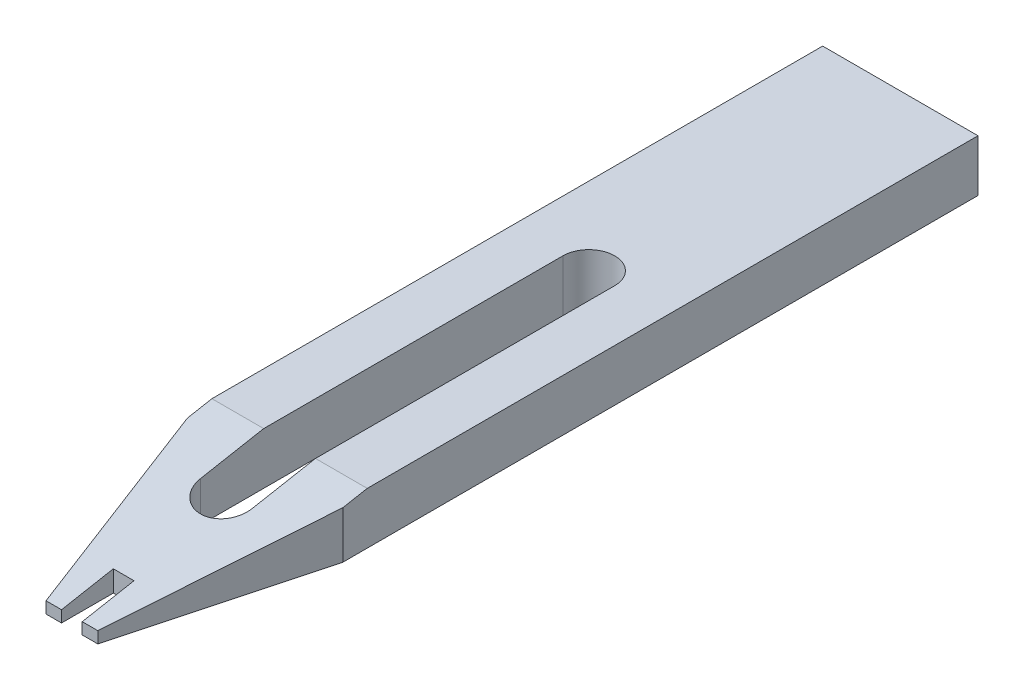
ISO-10303-21;
HEADER;
FILE_DESCRIPTION(('STEP AP214'),'2;1');
FILE_NAME('part.step','',(''),(''),'','','');
FILE_SCHEMA(('AUTOMOTIVE_DESIGN { 1 0 10303 214 1 1 1 1 }'));
ENDSEC;
DATA;
#1=APPLICATION_CONTEXT('core data for automotive mechanical design processes');
#2=APPLICATION_PROTOCOL_DEFINITION('international standard','automotive_design',2000,#1);
#3=PRODUCT_CONTEXT('',#1,'mechanical');
#4=PRODUCT('Part','Part','',(#3));
#5=PRODUCT_RELATED_PRODUCT_CATEGORY('part','',(#4));
#6=PRODUCT_DEFINITION_FORMATION('','',#4);
#7=PRODUCT_DEFINITION_CONTEXT('part definition',#1,'design');
#8=PRODUCT_DEFINITION('design','',#6,#7);
#9=PRODUCT_DEFINITION_SHAPE('','',#8);
#10=(LENGTH_UNIT() NAMED_UNIT(*) SI_UNIT(.MILLI.,.METRE.));
#11=(NAMED_UNIT(*) PLANE_ANGLE_UNIT() SI_UNIT($,.RADIAN.));
#12=(NAMED_UNIT(*) SI_UNIT($,.STERADIAN.) SOLID_ANGLE_UNIT());
#13=UNCERTAINTY_MEASURE_WITH_UNIT(LENGTH_MEASURE(1.E-05),#10,'distance_accuracy_value','');
#14=(GEOMETRIC_REPRESENTATION_CONTEXT(3) GLOBAL_UNCERTAINTY_ASSIGNED_CONTEXT((#13)) GLOBAL_UNIT_ASSIGNED_CONTEXT((#10,
#11,#12)) REPRESENTATION_CONTEXT('',''));
#15=CARTESIAN_POINT('',(0.,0.,0.));
#16=DIRECTION('',(0.,0.,1.));
#17=DIRECTION('',(1.,0.,0.));
#18=AXIS2_PLACEMENT_3D('',#15,#16,#17);
#19=CARTESIAN_POINT('',(7.50000000000001,5.,40.));
#20=DIRECTION('',(0.,-1.,0.));
#21=DIRECTION('',(0.,0.,-1.));
#22=AXIS2_PLACEMENT_3D('',#19,#20,#21);
#23=PLANE('',#22);
#24=DIRECTION('',(-1.,0.,0.));
#25=VECTOR('',#24,1.);
#26=CARTESIAN_POINT('',(7.50000000000001,5.,18.9793189364087));
#27=LINE('',#26,#25);
#28=CARTESIAN_POINT('',(7.5,5.,18.9793189364087));
#29=VERTEX_POINT('',#28);
#30=CARTESIAN_POINT('',(2.5,5.,18.9793189364087));
#31=VERTEX_POINT('',#30);
#32=EDGE_CURVE('E257',#29,#31,#27,.T.);
#33=ORIENTED_EDGE('',*,*,#32,.F.);
#34=DIRECTION('',(0.,0.,-1.));
#35=VECTOR('',#34,1.);
#36=CARTESIAN_POINT('',(7.5,5.,-40.));
#37=LINE('',#36,#35);
#38=CARTESIAN_POINT('',(7.5,5.,-40.));
#39=VERTEX_POINT('',#38);
#40=EDGE_CURVE('E150',#29,#39,#37,.T.);
#41=ORIENTED_EDGE('',*,*,#40,.T.);
#42=DIRECTION('',(-1.,0.,0.));
#43=VECTOR('',#42,1.);
#44=CARTESIAN_POINT('',(-7.5,5.,-40.));
#45=LINE('',#44,#43);
#46=CARTESIAN_POINT('',(-7.5,5.,-40.));
#47=VERTEX_POINT('',#46);
#48=EDGE_CURVE('E204',#39,#47,#45,.T.);
#49=ORIENTED_EDGE('',*,*,#48,.T.);
#50=DIRECTION('',(0.,0.,1.));
#51=VECTOR('',#50,1.);
#52=CARTESIAN_POINT('',(-7.5,5.,-40.));
#53=LINE('',#52,#51);
#54=CARTESIAN_POINT('',(-7.5,5.,18.9793189364087));
#55=VERTEX_POINT('',#54);
#56=EDGE_CURVE('E178',#47,#55,#53,.T.);
#57=ORIENTED_EDGE('',*,*,#56,.T.);
#58=CARTESIAN_POINT('',(-2.5,5.,18.9793189364087));
#59=VERTEX_POINT('',#58);
#60=EDGE_CURVE('E228',#59,#55,#27,.T.);
#61=ORIENTED_EDGE('',*,*,#60,.F.);
#62=DIRECTION('',(0.,0.,1.));
#63=VECTOR('',#62,1.);
#64=CARTESIAN_POINT('',(-2.5,5.,25.0787734286576));
#65=LINE('',#64,#63);
#66=CARTESIAN_POINT('',(-2.5,5.,-9.92122657134237));
#67=VERTEX_POINT('',#66);
#68=EDGE_CURVE('E214',#67,#59,#65,.T.);
#69=ORIENTED_EDGE('',*,*,#68,.F.);
#70=CARTESIAN_POINT('',(0.,5.,-9.92122657134237));
#71=DIRECTION('',(0.,1.,0.));
#72=DIRECTION('',(0.,0.,1.));
#73=AXIS2_PLACEMENT_3D('',#70,#71,#72);
#74=CIRCLE('',#73,2.5);
#75=CARTESIAN_POINT('',(2.5,5.,-9.92122657134237));
#76=VERTEX_POINT('',#75);
#77=EDGE_CURVE('E231',#76,#67,#74,.T.);
#78=ORIENTED_EDGE('',*,*,#77,.F.);
#79=DIRECTION('',(0.,0.,-1.));
#80=VECTOR('',#79,1.);
#81=CARTESIAN_POINT('',(2.5,5.,25.0787734286576));
#82=LINE('',#81,#80);
#83=EDGE_CURVE('E218',#31,#76,#82,.T.);
#84=ORIENTED_EDGE('',*,*,#83,.F.);
#85=EDGE_LOOP('',(#33,#41,#49,#57,#61,#69,#78,#84));
#86=FACE_BOUND('',#85,.T.);
#87=ADVANCED_FACE('F31',(#86),#23,.F.);
#88=CARTESIAN_POINT('',(1.00000000000001,5.,40.));
#89=DIRECTION('',(0.,0.,-1.));
#90=DIRECTION('',(-1.,0.,0.));
#91=AXIS2_PLACEMENT_3D('',#88,#89,#90);
#92=PLANE('',#91);
#93=DIRECTION('',(1.,0.,0.));
#94=VECTOR('',#93,1.);
#95=CARTESIAN_POINT('',(1.00000000000001,1.11230414737882,40.));
#96=LINE('',#95,#94);
#97=CARTESIAN_POINT('',(1.00000000000001,1.11230414737882,40.));
#98=VERTEX_POINT('',#97);
#99=CARTESIAN_POINT('',(2.5,1.11230414737882,40.));
#100=VERTEX_POINT('',#99);
#101=EDGE_CURVE('E46',#98,#100,#96,.T.);
#102=ORIENTED_EDGE('',*,*,#101,.F.);
#103=DIRECTION('',(0.,-1.,0.));
#104=VECTOR('',#103,1.);
#105=CARTESIAN_POINT('',(1.00000000000001,5.,40.));
#106=LINE('',#105,#104);
#107=CARTESIAN_POINT('',(1.00000000000001,0.,40.));
#108=VERTEX_POINT('',#107);
#109=EDGE_CURVE('E176',#98,#108,#106,.T.);
#110=ORIENTED_EDGE('',*,*,#109,.T.);
#111=DIRECTION('',(1.,0.,0.));
#112=VECTOR('',#111,1.);
#113=CARTESIAN_POINT('',(1.00000000000001,0.,40.));
#114=LINE('',#113,#112);
#115=CARTESIAN_POINT('',(2.5,0.,40.));
#116=VERTEX_POINT('',#115);
#117=EDGE_CURVE('E198',#108,#116,#114,.T.);
#118=ORIENTED_EDGE('',*,*,#117,.T.);
#119=DIRECTION('',(0.,1.,0.));
#120=VECTOR('',#119,1.);
#121=CARTESIAN_POINT('',(2.5,5.,40.));
#122=LINE('',#121,#120);
#123=EDGE_CURVE('E39',#116,#100,#122,.T.);
#124=ORIENTED_EDGE('',*,*,#123,.T.);
#125=EDGE_LOOP('',(#102,#110,#118,#124));
#126=FACE_BOUND('',#125,.T.);
#127=ADVANCED_FACE('F302',(#126),#92,.F.);
#128=CARTESIAN_POINT('',(7.5,5.,-40.));
#129=DIRECTION('',(-1.,0.,0.));
#130=DIRECTION('',(0.,0.,1.));
#131=AXIS2_PLACEMENT_3D('',#128,#129,#130);
#132=PLANE('',#131);
#133=DIRECTION('',(0.,0.18186208197361,-0.983324047880567));
#134=VECTOR('',#133,1.);
#135=CARTESIAN_POINT('',(7.5,15.5472337761972,-38.0493288069829));
#136=LINE('',#135,#134);
#137=CARTESIAN_POINT('',(7.50000000000011,4.56344790491569,21.3397459621553));
#138=VERTEX_POINT('',#137);
#139=EDGE_CURVE('E142',#138,#29,#136,.T.);
#140=ORIENTED_EDGE('',*,*,#139,.F.);
#141=DIRECTION('',(0.,-1.,0.));
#142=VECTOR('',#141,1.);
#143=CARTESIAN_POINT('',(7.5,5.,21.3397459621557));
#144=LINE('',#143,#142);
#145=CARTESIAN_POINT('',(7.50000000000005,0.,21.3397459621553));
#146=VERTEX_POINT('',#145);
#147=EDGE_CURVE('E53',#138,#146,#144,.T.);
#148=ORIENTED_EDGE('',*,*,#147,.T.);
#149=DIRECTION('',(0.,0.,-1.));
#150=VECTOR('',#149,1.);
#151=CARTESIAN_POINT('',(7.5,0.,-40.));
#152=LINE('',#151,#150);
#153=CARTESIAN_POINT('',(7.5,0.,-40.));
#154=VERTEX_POINT('',#153);
#155=EDGE_CURVE('E196',#146,#154,#152,.T.);
#156=ORIENTED_EDGE('',*,*,#155,.T.);
#157=DIRECTION('',(0.,-1.,0.));
#158=VECTOR('',#157,1.);
#159=CARTESIAN_POINT('',(7.5,5.,-40.));
#160=LINE('',#159,#158);
#161=EDGE_CURVE('E164',#39,#154,#160,.T.);
#162=ORIENTED_EDGE('',*,*,#161,.F.);
#163=ORIENTED_EDGE('',*,*,#40,.F.);
#164=EDGE_LOOP('',(#140,#148,#156,#162,#163));
#165=FACE_BOUND('',#164,.T.);
#166=ADVANCED_FACE('F148',(#165),#132,.F.);
#167=CARTESIAN_POINT('',(-7.5,5.,-40.));
#168=DIRECTION('',(1.,0.,0.));
#169=DIRECTION('',(0.,0.,-1.));
#170=AXIS2_PLACEMENT_3D('',#167,#168,#169);
#171=PLANE('',#170);
#172=DIRECTION('',(0.,-0.18186208197361,0.983324047880567));
#173=VECTOR('',#172,1.);
#174=CARTESIAN_POINT('',(-7.5,15.5472337761972,-38.0493288069829));
#175=LINE('',#174,#173);
#176=CARTESIAN_POINT('',(-7.50000000000014,4.56344790491572,21.3397459621551));
#177=VERTEX_POINT('',#176);
#178=EDGE_CURVE('E235',#55,#177,#175,.T.);
#179=ORIENTED_EDGE('',*,*,#178,.F.);
#180=ORIENTED_EDGE('',*,*,#56,.F.);
#181=DIRECTION('',(0.,-1.,0.));
#182=VECTOR('',#181,1.);
#183=CARTESIAN_POINT('',(-7.5,5.,-40.));
#184=LINE('',#183,#182);
#185=CARTESIAN_POINT('',(-7.5,0.,-40.));
#186=VERTEX_POINT('',#185);
#187=EDGE_CURVE('E167',#47,#186,#184,.T.);
#188=ORIENTED_EDGE('',*,*,#187,.T.);
#189=DIRECTION('',(0.,0.,1.));
#190=VECTOR('',#189,1.);
#191=CARTESIAN_POINT('',(-7.5,0.,-40.));
#192=LINE('',#191,#190);
#193=CARTESIAN_POINT('',(-7.5,0.,21.3397459621557));
#194=VERTEX_POINT('',#193);
#195=EDGE_CURVE('E191',#186,#194,#192,.T.);
#196=ORIENTED_EDGE('',*,*,#195,.T.);
#197=DIRECTION('',(0.,1.,0.));
#198=VECTOR('',#197,1.);
#199=CARTESIAN_POINT('',(-7.5,5.,21.3397459621557));
#200=LINE('',#199,#198);
#201=EDGE_CURVE('E154',#194,#177,#200,.T.);
#202=ORIENTED_EDGE('',*,*,#201,.T.);
#203=EDGE_LOOP('',(#179,#180,#188,#196,#202));
#204=FACE_BOUND('',#203,.T.);
#205=ADVANCED_FACE('F265',(#204),#171,.F.);
#206=CARTESIAN_POINT('',(-0.999999999999995,5.,40.));
#207=DIRECTION('',(0.,0.,-1.));
#208=DIRECTION('',(-1.,0.,0.));
#209=AXIS2_PLACEMENT_3D('',#206,#207,#208);
#210=PLANE('',#209);
#211=DIRECTION('',(1.,0.,0.));
#212=VECTOR('',#211,1.);
#213=CARTESIAN_POINT('',(-0.999999999999995,1.11230414737882,40.));
#214=LINE('',#213,#212);
#215=CARTESIAN_POINT('',(-2.49999999999999,1.11230414737882,40.));
#216=VERTEX_POINT('',#215);
#217=CARTESIAN_POINT('',(-0.999999999999995,1.11230414737882,40.));
#218=VERTEX_POINT('',#217);
#219=EDGE_CURVE('E243',#216,#218,#214,.T.);
#220=ORIENTED_EDGE('',*,*,#219,.F.);
#221=DIRECTION('',(0.,-1.,0.));
#222=VECTOR('',#221,1.);
#223=CARTESIAN_POINT('',(-2.49999999999998,5.,40.));
#224=LINE('',#223,#222);
#225=CARTESIAN_POINT('',(-2.49999999999999,0.,40.));
#226=VERTEX_POINT('',#225);
#227=EDGE_CURVE('E162',#216,#226,#224,.T.);
#228=ORIENTED_EDGE('',*,*,#227,.T.);
#229=DIRECTION('',(1.,0.,0.));
#230=VECTOR('',#229,1.);
#231=CARTESIAN_POINT('',(-0.999999999999995,0.,40.));
#232=LINE('',#231,#230);
#233=CARTESIAN_POINT('',(-0.999999999999995,0.,40.));
#234=VERTEX_POINT('',#233);
#235=EDGE_CURVE('E188',#226,#234,#232,.T.);
#236=ORIENTED_EDGE('',*,*,#235,.T.);
#237=DIRECTION('',(0.,-1.,0.));
#238=VECTOR('',#237,1.);
#239=CARTESIAN_POINT('',(-0.999999999999995,5.,40.));
#240=LINE('',#239,#238);
#241=EDGE_CURVE('E170',#218,#234,#240,.T.);
#242=ORIENTED_EDGE('',*,*,#241,.F.);
#243=EDGE_LOOP('',(#220,#228,#236,#242));
#244=FACE_BOUND('',#243,.T.);
#245=ADVANCED_FACE('F286',(#244),#210,.F.);
#246=CARTESIAN_POINT('',(-0.999999999999995,5.,40.));
#247=DIRECTION('',(-1.,0.,0.));
#248=DIRECTION('',(0.,0.,1.));
#249=AXIS2_PLACEMENT_3D('',#246,#247,#248);
#250=PLANE('',#249);
#251=DIRECTION('',(0.,0.18186208197361,-0.983324047880567));
#252=VECTOR('',#251,1.);
#253=CARTESIAN_POINT('',(-0.999999999999995,1.24088508801492,39.304765844235));
#254=LINE('',#253,#252);
#255=CARTESIAN_POINT('',(-0.999999999999996,2.03703533017452,35.));
#256=VERTEX_POINT('',#255);
#257=EDGE_CURVE('E245',#218,#256,#254,.T.);
#258=ORIENTED_EDGE('',*,*,#257,.F.);
#259=ORIENTED_EDGE('',*,*,#241,.T.);
#260=DIRECTION('',(0.,0.,-1.));
#261=VECTOR('',#260,1.);
#262=CARTESIAN_POINT('',(-0.999999999999995,0.,40.));
#263=LINE('',#262,#261);
#264=CARTESIAN_POINT('',(-0.999999999999996,0.,35.));
#265=VERTEX_POINT('',#264);
#266=EDGE_CURVE('E185',#234,#265,#263,.T.);
#267=ORIENTED_EDGE('',*,*,#266,.T.);
#268=DIRECTION('',(0.,-1.,0.));
#269=VECTOR('',#268,1.);
#270=CARTESIAN_POINT('',(-0.999999999999996,5.,35.));
#271=LINE('',#270,#269);
#272=EDGE_CURVE('E172',#256,#265,#271,.T.);
#273=ORIENTED_EDGE('',*,*,#272,.F.);
#274=EDGE_LOOP('',(#258,#259,#267,#273));
#275=FACE_BOUND('',#274,.T.);
#276=ADVANCED_FACE('F288',(#275),#250,.F.);
#277=CARTESIAN_POINT('',(-0.999999999999996,5.,35.));
#278=DIRECTION('',(0.,0.,-1.));
#279=DIRECTION('',(-1.,0.,0.));
#280=AXIS2_PLACEMENT_3D('',#277,#278,#279);
#281=PLANE('',#280);
#282=DIRECTION('',(1.,0.,0.));
#283=VECTOR('',#282,1.);
#284=CARTESIAN_POINT('',(-0.999999999999996,2.03703533017452,35.));
#285=LINE('',#284,#283);
#286=CARTESIAN_POINT('',(1.,2.03703533017452,35.));
#287=VERTEX_POINT('',#286);
#288=EDGE_CURVE('E247',#256,#287,#285,.T.);
#289=ORIENTED_EDGE('',*,*,#288,.F.);
#290=ORIENTED_EDGE('',*,*,#272,.T.);
#291=DIRECTION('',(1.,0.,0.));
#292=VECTOR('',#291,1.);
#293=CARTESIAN_POINT('',(-0.999999999999996,0.,35.));
#294=LINE('',#293,#292);
#295=CARTESIAN_POINT('',(1.,0.,35.));
#296=VERTEX_POINT('',#295);
#297=EDGE_CURVE('E182',#265,#296,#294,.T.);
#298=ORIENTED_EDGE('',*,*,#297,.T.);
#299=DIRECTION('',(0.,-1.,0.));
#300=VECTOR('',#299,1.);
#301=CARTESIAN_POINT('',(1.,5.,35.));
#302=LINE('',#301,#300);
#303=EDGE_CURVE('E174',#287,#296,#302,.T.);
#304=ORIENTED_EDGE('',*,*,#303,.F.);
#305=EDGE_LOOP('',(#289,#290,#298,#304));
#306=FACE_BOUND('',#305,.T.);
#307=ADVANCED_FACE('F295',(#306),#281,.F.);
#308=CARTESIAN_POINT('',(1.,5.,35.));
#309=DIRECTION('',(1.,0.,0.));
#310=DIRECTION('',(0.,0.,-1.));
#311=AXIS2_PLACEMENT_3D('',#308,#309,#310);
#312=PLANE('',#311);
#313=DIRECTION('',(0.,-0.18186208197361,0.983324047880567));
#314=VECTOR('',#313,1.);
#315=CARTESIAN_POINT('',(1.,2.13503188102631,34.4701349285339));
#316=LINE('',#315,#314);
#317=EDGE_CURVE('E249',#287,#98,#316,.T.);
#318=ORIENTED_EDGE('',*,*,#317,.F.);
#319=ORIENTED_EDGE('',*,*,#303,.T.);
#320=DIRECTION('',(0.,0.,1.));
#321=VECTOR('',#320,1.);
#322=CARTESIAN_POINT('',(1.,0.,35.));
#323=LINE('',#322,#321);
#324=EDGE_CURVE('E179',#296,#108,#323,.T.);
#325=ORIENTED_EDGE('',*,*,#324,.T.);
#326=ORIENTED_EDGE('',*,*,#109,.F.);
#327=EDGE_LOOP('',(#318,#319,#325,#326));
#328=FACE_BOUND('',#327,.T.);
#329=ADVANCED_FACE('F298',(#328),#312,.F.);
#330=CARTESIAN_POINT('',(0.,5.,25.0787734286576));
#331=DIRECTION('',(0.,-1.,0.));
#332=DIRECTION('',(0.,0.,-1.));
#333=AXIS2_PLACEMENT_3D('',#330,#331,#332);
#334=CYLINDRICAL_SURFACE('',#333,2.5);
#335=DIRECTION('',(0.,-1.,0.));
#336=VECTOR('',#335,1.);
#337=CARTESIAN_POINT('',(-2.5,5.,25.0787734286576));
#338=LINE('',#337,#336);
#339=CARTESIAN_POINT('',(-2.5,3.87192884659483,25.0787734286576));
#340=VERTEX_POINT('',#339);
#341=CARTESIAN_POINT('',(-2.5,0.,25.0787734286576));
#342=VERTEX_POINT('',#341);
#343=EDGE_CURVE('E212',#340,#342,#338,.T.);
#344=ORIENTED_EDGE('',*,*,#343,.F.);
#345=CARTESIAN_POINT('',(0.,3.87192884659483,25.0787734286576));
#346=DIRECTION('',(0.,0.983324047880567,0.18186208197361));
#347=DIRECTION('',(0.,-0.18186208197361,0.983324047880567));
#348=AXIS2_PLACEMENT_3D('',#345,#346,#347);
#349=ELLIPSE('',#348,2.54239688878599,2.5);
#350=CARTESIAN_POINT('',(2.5,3.87192884659483,25.0787734286576));
#351=VERTEX_POINT('',#350);
#352=EDGE_CURVE('E251',#340,#351,#349,.T.);
#353=ORIENTED_EDGE('',*,*,#352,.T.);
#354=DIRECTION('',(0.,-1.,0.));
#355=VECTOR('',#354,1.);
#356=CARTESIAN_POINT('',(2.5,5.,25.0787734286576));
#357=LINE('',#356,#355);
#358=CARTESIAN_POINT('',(2.5,0.,25.0787734286576));
#359=VERTEX_POINT('',#358);
#360=EDGE_CURVE('E201',#351,#359,#357,.T.);
#361=ORIENTED_EDGE('',*,*,#360,.T.);
#362=CARTESIAN_POINT('',(0.,0.,25.0787734286576));
#363=DIRECTION('',(0.,1.,0.));
#364=DIRECTION('',(0.,0.,1.));
#365=AXIS2_PLACEMENT_3D('',#362,#363,#364);
#366=CIRCLE('',#365,2.5);
#367=EDGE_CURVE('E225',#342,#359,#366,.T.);
#368=ORIENTED_EDGE('',*,*,#367,.F.);
#369=EDGE_LOOP('',(#344,#353,#361,#368));
#370=FACE_BOUND('',#369,.T.);
#371=ADVANCED_FACE('F324',(#370),#334,.F.);
#372=CARTESIAN_POINT('',(2.5,5.,25.0787734286576));
#373=DIRECTION('',(-1.,0.,0.));
#374=DIRECTION('',(0.,0.,1.));
#375=AXIS2_PLACEMENT_3D('',#372,#373,#374);
#376=PLANE('',#375);
#377=ORIENTED_EDGE('',*,*,#360,.F.);
#378=DIRECTION('',(0.,0.18186208197361,-0.983324047880567));
#379=VECTOR('',#378,1.);
#380=CARTESIAN_POINT('',(2.5,3.90923846532735,24.8770411878365));
#381=LINE('',#380,#379);
#382=EDGE_CURVE('E254',#351,#31,#381,.T.);
#383=ORIENTED_EDGE('',*,*,#382,.T.);
#384=ORIENTED_EDGE('',*,*,#83,.T.);
#385=DIRECTION('',(0.,-1.,0.));
#386=VECTOR('',#385,1.);
#387=CARTESIAN_POINT('',(2.5,5.,-9.92122657134237));
#388=LINE('',#387,#386);
#389=CARTESIAN_POINT('',(2.5,0.,-9.92122657134237));
#390=VERTEX_POINT('',#389);
#391=EDGE_CURVE('E208',#76,#390,#388,.T.);
#392=ORIENTED_EDGE('',*,*,#391,.T.);
#393=DIRECTION('',(0.,0.,-1.));
#394=VECTOR('',#393,1.);
#395=CARTESIAN_POINT('',(2.5,0.,25.0787734286576));
#396=LINE('',#395,#394);
#397=EDGE_CURVE('E222',#359,#390,#396,.T.);
#398=ORIENTED_EDGE('',*,*,#397,.F.);
#399=EDGE_LOOP('',(#377,#383,#384,#392,#398));
#400=FACE_BOUND('',#399,.T.);
#401=ADVANCED_FACE('F318',(#400),#376,.T.);
#402=CARTESIAN_POINT('',(-2.5,5.,25.0787734286576));
#403=DIRECTION('',(1.,0.,0.));
#404=DIRECTION('',(0.,0.,-1.));
#405=AXIS2_PLACEMENT_3D('',#402,#403,#404);
#406=PLANE('',#405);
#407=ORIENTED_EDGE('',*,*,#68,.T.);
#408=DIRECTION('',(0.,-0.18186208197361,0.983324047880567));
#409=VECTOR('',#408,1.);
#410=CARTESIAN_POINT('',(-2.5,3.90923846532735,24.8770411878365));
#411=LINE('',#410,#409);
#412=EDGE_CURVE('E237',#59,#340,#411,.T.);
#413=ORIENTED_EDGE('',*,*,#412,.T.);
#414=ORIENTED_EDGE('',*,*,#343,.T.);
#415=DIRECTION('',(0.,0.,1.));
#416=VECTOR('',#415,1.);
#417=CARTESIAN_POINT('',(-2.5,0.,25.0787734286576));
#418=LINE('',#417,#416);
#419=CARTESIAN_POINT('',(-2.5,0.,-9.92122657134237));
#420=VERTEX_POINT('',#419);
#421=EDGE_CURVE('E215',#420,#342,#418,.T.);
#422=ORIENTED_EDGE('',*,*,#421,.F.);
#423=DIRECTION('',(0.,-1.,0.));
#424=VECTOR('',#423,1.);
#425=CARTESIAN_POINT('',(-2.5,5.,-9.92122657134237));
#426=LINE('',#425,#424);
#427=EDGE_CURVE('E210',#67,#420,#426,.T.);
#428=ORIENTED_EDGE('',*,*,#427,.F.);
#429=EDGE_LOOP('',(#407,#413,#414,#422,#428));
#430=FACE_BOUND('',#429,.T.);
#431=ADVANCED_FACE('F313',(#430),#406,.T.);
#432=CARTESIAN_POINT('',(-2.49999999999998,5.,40.));
#433=DIRECTION('',(0.965925826289068,0.,-0.258819045102522));
#434=DIRECTION('',(-0.258819045102522,0.,-0.965925826289068));
#435=AXIS2_PLACEMENT_3D('',#432,#433,#434);
#436=PLANE('',#435);
#437=ORIENTED_EDGE('',*,*,#227,.F.);
#438=DIRECTION('',(0.254785389380788,-0.175860201214618,0.950872018195317));
#439=VECTOR('',#438,1.);
#440=CARTESIAN_POINT('',(-2.67419447125683,1.23253817979391,39.3498973828719));
#441=LINE('',#440,#439);
#442=EDGE_CURVE('E240',#216,#177,#441,.F.);
#443=ORIENTED_EDGE('',*,*,#442,.T.);
#444=ORIENTED_EDGE('',*,*,#201,.F.);
#445=DIRECTION('',(0.258819045102522,0.,0.965925826289068));
#446=VECTOR('',#445,1.);
#447=CARTESIAN_POINT('',(-1.83012701892217,0.,42.5));
#448=LINE('',#447,#446);
#449=EDGE_CURVE('E157',#226,#194,#448,.F.);
#450=ORIENTED_EDGE('',*,*,#449,.F.);
#451=EDGE_LOOP('',(#437,#443,#444,#450));
#452=FACE_BOUND('',#451,.T.);
#453=ADVANCED_FACE('F281',(#452),#436,.F.);
#454=CARTESIAN_POINT('',(7.5,5.,21.3397459621557));
#455=DIRECTION('',(-0.965925826289068,0.,-0.258819045102522));
#456=DIRECTION('',(-0.258819045102522,0.,0.965925826289068));
#457=AXIS2_PLACEMENT_3D('',#454,#455,#456);
#458=PLANE('',#457);
#459=ORIENTED_EDGE('',*,*,#147,.F.);
#460=DIRECTION('',(0.254785389380788,0.175860201214618,-0.950872018195317));
#461=VECTOR('',#460,1.);
#462=CARTESIAN_POINT('',(7.51956041940062,4.57694906877746,21.2667454831353));
#463=LINE('',#462,#461);
#464=EDGE_CURVE('E11',#138,#100,#463,.F.);
#465=ORIENTED_EDGE('',*,*,#464,.T.);
#466=ORIENTED_EDGE('',*,*,#123,.F.);
#467=DIRECTION('',(0.258819045102522,0.,-0.965925826289068));
#468=VECTOR('',#467,1.);
#469=CARTESIAN_POINT('',(2.83493649053891,0.,38.75));
#470=LINE('',#469,#468);
#471=EDGE_CURVE('E152',#146,#116,#470,.F.);
#472=ORIENTED_EDGE('',*,*,#471,.F.);
#473=EDGE_LOOP('',(#459,#465,#466,#472));
#474=FACE_BOUND('',#473,.T.);
#475=ADVANCED_FACE('F33',(#474),#458,.F.);
#476=CARTESIAN_POINT('',(7.50000000000001,0.,40.));
#477=DIRECTION('',(0.,-1.,0.));
#478=DIRECTION('',(0.,0.,-1.));
#479=AXIS2_PLACEMENT_3D('',#476,#477,#478);
#480=PLANE('',#479);
#481=ORIENTED_EDGE('',*,*,#235,.F.);
#482=ORIENTED_EDGE('',*,*,#449,.T.);
#483=ORIENTED_EDGE('',*,*,#195,.F.);
#484=DIRECTION('',(-1.,0.,0.));
#485=VECTOR('',#484,1.);
#486=CARTESIAN_POINT('',(-7.5,0.,-40.));
#487=LINE('',#486,#485);
#488=EDGE_CURVE('E194',#154,#186,#487,.T.);
#489=ORIENTED_EDGE('',*,*,#488,.F.);
#490=ORIENTED_EDGE('',*,*,#155,.F.);
#491=ORIENTED_EDGE('',*,*,#471,.T.);
#492=ORIENTED_EDGE('',*,*,#117,.F.);
#493=ORIENTED_EDGE('',*,*,#324,.F.);
#494=ORIENTED_EDGE('',*,*,#297,.F.);
#495=ORIENTED_EDGE('',*,*,#266,.F.);
#496=EDGE_LOOP('',(#481,#482,#483,#489,#490,#491,#492,#493,#494,#495));
#497=FACE_BOUND('',#496,.T.);
#498=ORIENTED_EDGE('',*,*,#421,.T.);
#499=ORIENTED_EDGE('',*,*,#367,.T.);
#500=ORIENTED_EDGE('',*,*,#397,.T.);
#501=CARTESIAN_POINT('',(0.,0.,-9.92122657134237));
#502=DIRECTION('',(0.,1.,0.));
#503=DIRECTION('',(0.,0.,1.));
#504=AXIS2_PLACEMENT_3D('',#501,#502,#503);
#505=CIRCLE('',#504,2.5);
#506=EDGE_CURVE('E219',#390,#420,#505,.T.);
#507=ORIENTED_EDGE('',*,*,#506,.T.);
#508=EDGE_LOOP('',(#498,#499,#500,#507));
#509=FACE_BOUND('',#508,.T.);
#510=ADVANCED_FACE('F275',(#497,#509),#480,.T.);
#511=CARTESIAN_POINT('',(-7.5,5.,-40.));
#512=DIRECTION('',(0.,0.,1.));
#513=DIRECTION('',(1.,0.,0.));
#514=AXIS2_PLACEMENT_3D('',#511,#512,#513);
#515=PLANE('',#514);
#516=ORIENTED_EDGE('',*,*,#488,.T.);
#517=ORIENTED_EDGE('',*,*,#187,.F.);
#518=ORIENTED_EDGE('',*,*,#48,.F.);
#519=ORIENTED_EDGE('',*,*,#161,.T.);
#520=EDGE_LOOP('',(#516,#517,#518,#519));
#521=FACE_BOUND('',#520,.T.);
#522=ADVANCED_FACE('F270',(#521),#515,.F.);
#523=CARTESIAN_POINT('',(0.,5.,-9.92122657134237));
#524=DIRECTION('',(0.,-1.,0.));
#525=DIRECTION('',(0.,0.,-1.));
#526=AXIS2_PLACEMENT_3D('',#523,#524,#525);
#527=CYLINDRICAL_SURFACE('',#526,2.5);
#528=ORIENTED_EDGE('',*,*,#506,.F.);
#529=ORIENTED_EDGE('',*,*,#391,.F.);
#530=ORIENTED_EDGE('',*,*,#77,.T.);
#531=ORIENTED_EDGE('',*,*,#427,.T.);
#532=EDGE_LOOP('',(#528,#529,#530,#531));
#533=FACE_BOUND('',#532,.T.);
#534=ADVANCED_FACE('F329',(#533),#527,.F.);
#535=CARTESIAN_POINT('',(10.,0.706295208605906,42.1952808898768));
#536=DIRECTION('',(0.,0.983324047880567,0.18186208197361));
#537=DIRECTION('',(0.,-0.18186208197361,0.983324047880567));
#538=AXIS2_PLACEMENT_3D('',#535,#536,#537);
#539=PLANE('',#538);
#540=ORIENTED_EDGE('',*,*,#60,.T.);
#541=ORIENTED_EDGE('',*,*,#178,.T.);
#542=ORIENTED_EDGE('',*,*,#442,.F.);
#543=ORIENTED_EDGE('',*,*,#219,.T.);
#544=ORIENTED_EDGE('',*,*,#257,.T.);
#545=ORIENTED_EDGE('',*,*,#288,.T.);
#546=ORIENTED_EDGE('',*,*,#317,.T.);
#547=ORIENTED_EDGE('',*,*,#101,.T.);
#548=ORIENTED_EDGE('',*,*,#464,.F.);
#549=ORIENTED_EDGE('',*,*,#139,.T.);
#550=ORIENTED_EDGE('',*,*,#32,.T.);
#551=ORIENTED_EDGE('',*,*,#382,.F.);
#552=ORIENTED_EDGE('',*,*,#352,.F.);
#553=ORIENTED_EDGE('',*,*,#412,.F.);
#554=EDGE_LOOP('',(#540,#541,#542,#543,#544,#545,#546,#547,#548,#549,#550,#551,#552,#553));
#555=FACE_BOUND('',#554,.T.);
#556=ADVANCED_FACE('F141',(#555),#539,.T.);
#557=CLOSED_SHELL('',(#87,#127,#166,#205,#245,#276,#307,#329,#371,#401,#431,#453,#475,#510,#522,
#534,#556));
#558=MANIFOLD_SOLID_BREP('B2',#557);
#559=ADVANCED_BREP_SHAPE_REPRESENTATION('',(#18,#558),#14);
#560=SHAPE_DEFINITION_REPRESENTATION(#9,#559);
ENDSEC;
END-ISO-10303-21;
